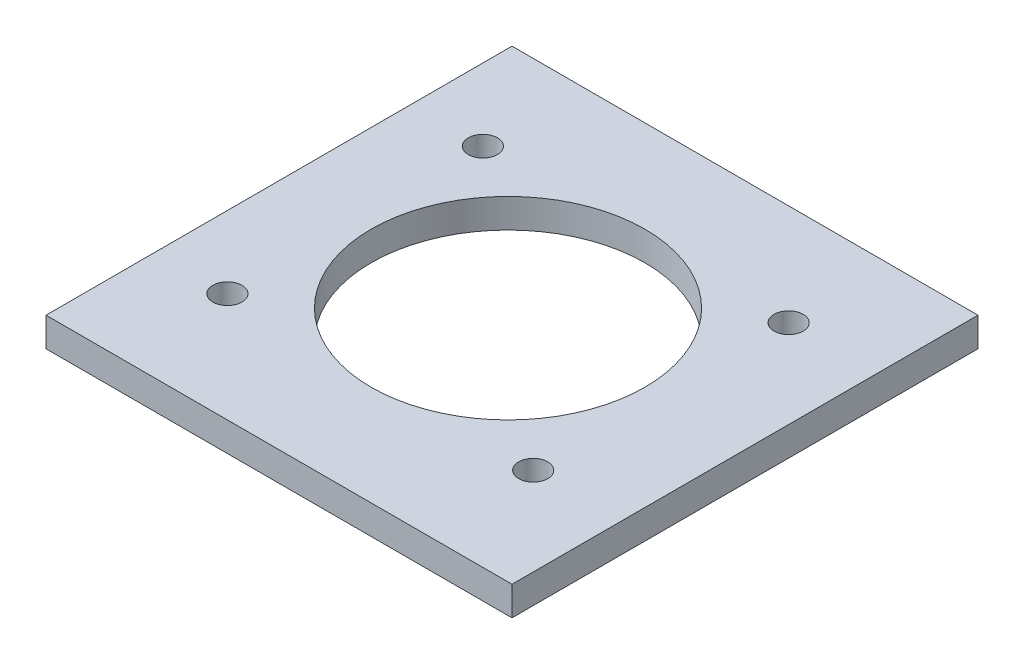
ISO-10303-21;
HEADER;
FILE_DESCRIPTION(('STEP AP214'),'2;1');
FILE_NAME('part.step','',(''),(''),'','','');
FILE_SCHEMA(('AUTOMOTIVE_DESIGN { 1 0 10303 214 1 1 1 1 }'));
ENDSEC;
DATA;
#1=APPLICATION_CONTEXT('core data for automotive mechanical design processes');
#2=APPLICATION_PROTOCOL_DEFINITION('international standard','automotive_design',2000,#1);
#3=PRODUCT_CONTEXT('',#1,'mechanical');
#4=PRODUCT('Part','Part','',(#3));
#5=PRODUCT_RELATED_PRODUCT_CATEGORY('part','',(#4));
#6=PRODUCT_DEFINITION_FORMATION('','',#4);
#7=PRODUCT_DEFINITION_CONTEXT('part definition',#1,'design');
#8=PRODUCT_DEFINITION('design','',#6,#7);
#9=PRODUCT_DEFINITION_SHAPE('','',#8);
#10=(LENGTH_UNIT() NAMED_UNIT(*) SI_UNIT(.MILLI.,.METRE.));
#11=(NAMED_UNIT(*) PLANE_ANGLE_UNIT() SI_UNIT($,.RADIAN.));
#12=(NAMED_UNIT(*) SI_UNIT($,.STERADIAN.) SOLID_ANGLE_UNIT());
#13=UNCERTAINTY_MEASURE_WITH_UNIT(LENGTH_MEASURE(1.E-05),#10,'distance_accuracy_value','');
#14=(GEOMETRIC_REPRESENTATION_CONTEXT(3) GLOBAL_UNCERTAINTY_ASSIGNED_CONTEXT((#13)) GLOBAL_UNIT_ASSIGNED_CONTEXT((#10,
#11,#12)) REPRESENTATION_CONTEXT('',''));
#15=CARTESIAN_POINT('',(0.,0.,0.));
#16=DIRECTION('',(0.,0.,1.));
#17=DIRECTION('',(1.,0.,0.));
#18=AXIS2_PLACEMENT_3D('',#15,#16,#17);
#19=CARTESIAN_POINT('',(0.,4.,0.));
#20=DIRECTION('',(0.,1.,0.));
#21=DIRECTION('',(0.,0.,1.));
#22=AXIS2_PLACEMENT_3D('',#19,#20,#21);
#23=PLANE('',#22);
#24=CARTESIAN_POINT('',(9.89792515025473,4.,-15.0138738301273));
#25=DIRECTION('',(0.,1.,0.));
#26=DIRECTION('',(0.,0.,1.));
#27=AXIS2_PLACEMENT_3D('',#24,#25,#26);
#28=CIRCLE('',#27,2.);
#29=CARTESIAN_POINT('',(9.89792515025473,4.,-13.0138738301273));
#30=VERTEX_POINT('',#29);
#31=EDGE_CURVE('E257',#30,#30,#28,.T.);
#32=ORIENTED_EDGE('',*,*,#31,.F.);
#33=EDGE_LOOP('',(#32));
#34=FACE_BOUND('',#33,.T.);
#35=CARTESIAN_POINT('',(30.8929251502547,4.,-32.5588738301273));
#36=DIRECTION('',(0.,1.,0.));
#37=DIRECTION('',(0.,0.,1.));
#38=AXIS2_PLACEMENT_3D('',#35,#36,#37);
#39=CIRCLE('',#38,18.8);
#40=CARTESIAN_POINT('',(30.8929251502547,4.,-13.7588738301272));
#41=VERTEX_POINT('',#40);
#42=EDGE_CURVE('E273',#41,#41,#39,.T.);
#43=ORIENTED_EDGE('',*,*,#42,.F.);
#44=EDGE_LOOP('',(#43));
#45=FACE_BOUND('',#44,.T.);
#46=DIRECTION('',(1.,0.,0.));
#47=VECTOR('',#46,1.);
#48=CARTESIAN_POINT('',(0.,4.,-64.));
#49=LINE('',#48,#47);
#50=CARTESIAN_POINT('',(0.,4.,-64.));
#51=VERTEX_POINT('',#50);
#52=CARTESIAN_POINT('',(64.,4.,-64.));
#53=VERTEX_POINT('',#52);
#54=EDGE_CURVE('E177',#51,#53,#49,.T.);
#55=ORIENTED_EDGE('',*,*,#54,.F.);
#56=DIRECTION('',(0.,0.,-1.));
#57=VECTOR('',#56,1.);
#58=CARTESIAN_POINT('',(0.,4.,0.));
#59=LINE('',#58,#57);
#60=CARTESIAN_POINT('',(0.,4.,0.));
#61=VERTEX_POINT('',#60);
#62=EDGE_CURVE('E164',#61,#51,#59,.T.);
#63=ORIENTED_EDGE('',*,*,#62,.F.);
#64=DIRECTION('',(1.,0.,0.));
#65=VECTOR('',#64,1.);
#66=CARTESIAN_POINT('',(0.,4.,0.));
#67=LINE('',#66,#65);
#68=CARTESIAN_POINT('',(64.,4.,0.));
#69=VERTEX_POINT('',#68);
#70=EDGE_CURVE('E161',#61,#69,#67,.T.);
#71=ORIENTED_EDGE('',*,*,#70,.T.);
#72=DIRECTION('',(0.,0.,-1.));
#73=VECTOR('',#72,1.);
#74=CARTESIAN_POINT('',(64.,4.,0.));
#75=LINE('',#74,#73);
#76=EDGE_CURVE('E158',#69,#53,#75,.T.);
#77=ORIENTED_EDGE('',*,*,#76,.T.);
#78=EDGE_LOOP('',(#55,#63,#71,#77));
#79=FACE_BOUND('',#78,.T.);
#80=CARTESIAN_POINT('',(51.8929251502547,4.,-50.0988738301273));
#81=DIRECTION('',(0.,1.,0.));
#82=DIRECTION('',(0.,0.,1.));
#83=AXIS2_PLACEMENT_3D('',#80,#81,#82);
#84=CIRCLE('',#83,2.);
#85=CARTESIAN_POINT('',(51.8929251502547,4.,-48.0988738301273));
#86=VERTEX_POINT('',#85);
#87=EDGE_CURVE('E191',#86,#86,#84,.T.);
#88=ORIENTED_EDGE('',*,*,#87,.F.);
#89=EDGE_LOOP('',(#88));
#90=FACE_BOUND('',#89,.T.);
#91=CARTESIAN_POINT('',(9.89792515025473,4.,-50.0988738301273));
#92=DIRECTION('',(0.,1.,0.));
#93=DIRECTION('',(0.,0.,1.));
#94=AXIS2_PLACEMENT_3D('',#91,#92,#93);
#95=CIRCLE('',#94,2.00000000000001);
#96=CARTESIAN_POINT('',(9.89792515025473,4.,-48.0988738301273));
#97=VERTEX_POINT('',#96);
#98=EDGE_CURVE('E265',#97,#97,#95,.T.);
#99=ORIENTED_EDGE('',*,*,#98,.F.);
#100=EDGE_LOOP('',(#99));
#101=FACE_BOUND('',#100,.T.);
#102=CARTESIAN_POINT('',(51.8979251502547,4.,-15.0138738301273));
#103=DIRECTION('',(0.,1.,0.));
#104=DIRECTION('',(0.,0.,1.));
#105=AXIS2_PLACEMENT_3D('',#102,#103,#104);
#106=CIRCLE('',#105,2.);
#107=CARTESIAN_POINT('',(51.8979251502547,4.,-13.0138738301273));
#108=VERTEX_POINT('',#107);
#109=EDGE_CURVE('E246',#108,#108,#106,.T.);
#110=ORIENTED_EDGE('',*,*,#109,.F.);
#111=EDGE_LOOP('',(#110));
#112=FACE_BOUND('',#111,.T.);
#113=ADVANCED_FACE('F114',(#34,#45,#79,#90,#101,#112),#23,.T.);
#114=CARTESIAN_POINT('',(0.,0.,0.));
#115=DIRECTION('',(0.,1.,0.));
#116=DIRECTION('',(0.,0.,1.));
#117=AXIS2_PLACEMENT_3D('',#114,#115,#116);
#118=PLANE('',#117);
#119=DIRECTION('',(1.,0.,0.));
#120=VECTOR('',#119,1.);
#121=CARTESIAN_POINT('',(0.,0.,-64.));
#122=LINE('',#121,#120);
#123=CARTESIAN_POINT('',(0.,0.,-64.));
#124=VERTEX_POINT('',#123);
#125=CARTESIAN_POINT('',(64.,0.,-64.));
#126=VERTEX_POINT('',#125);
#127=EDGE_CURVE('E186',#124,#126,#122,.T.);
#128=ORIENTED_EDGE('',*,*,#127,.T.);
#129=DIRECTION('',(0.,0.,-1.));
#130=VECTOR('',#129,1.);
#131=CARTESIAN_POINT('',(64.,0.,0.));
#132=LINE('',#131,#130);
#133=CARTESIAN_POINT('',(64.,0.,0.));
#134=VERTEX_POINT('',#133);
#135=EDGE_CURVE('E190',#134,#126,#132,.T.);
#136=ORIENTED_EDGE('',*,*,#135,.F.);
#137=DIRECTION('',(1.,0.,0.));
#138=VECTOR('',#137,1.);
#139=CARTESIAN_POINT('',(0.,0.,0.));
#140=LINE('',#139,#138);
#141=CARTESIAN_POINT('',(0.,0.,0.));
#142=VERTEX_POINT('',#141);
#143=EDGE_CURVE('E170',#142,#134,#140,.T.);
#144=ORIENTED_EDGE('',*,*,#143,.F.);
#145=DIRECTION('',(0.,0.,-1.));
#146=VECTOR('',#145,1.);
#147=CARTESIAN_POINT('',(0.,0.,0.));
#148=LINE('',#147,#146);
#149=EDGE_CURVE('E180',#142,#124,#148,.T.);
#150=ORIENTED_EDGE('',*,*,#149,.T.);
#151=EDGE_LOOP('',(#128,#136,#144,#150));
#152=FACE_BOUND('',#151,.T.);
#153=CARTESIAN_POINT('',(51.8929251502547,0.,-50.0988738301273));
#154=DIRECTION('',(0.,1.,0.));
#155=DIRECTION('',(0.,0.,1.));
#156=AXIS2_PLACEMENT_3D('',#153,#154,#155);
#157=CIRCLE('',#156,2.);
#158=CARTESIAN_POINT('',(51.8929251502547,0.,-48.0988738301273));
#159=VERTEX_POINT('',#158);
#160=EDGE_CURVE('E277',#159,#159,#157,.T.);
#161=ORIENTED_EDGE('',*,*,#160,.T.);
#162=EDGE_LOOP('',(#161));
#163=FACE_BOUND('',#162,.T.);
#164=CARTESIAN_POINT('',(30.8929251502547,0.,-32.5588738301273));
#165=DIRECTION('',(0.,1.,0.));
#166=DIRECTION('',(0.,0.,1.));
#167=AXIS2_PLACEMENT_3D('',#164,#165,#166);
#168=CIRCLE('',#167,18.8);
#169=CARTESIAN_POINT('',(30.8929251502547,0.,-13.7588738301272));
#170=VERTEX_POINT('',#169);
#171=EDGE_CURVE('E269',#170,#170,#168,.T.);
#172=ORIENTED_EDGE('',*,*,#171,.T.);
#173=EDGE_LOOP('',(#172));
#174=FACE_BOUND('',#173,.T.);
#175=CARTESIAN_POINT('',(9.89792515025473,0.,-50.0988738301273));
#176=DIRECTION('',(0.,1.,0.));
#177=DIRECTION('',(0.,0.,1.));
#178=AXIS2_PLACEMENT_3D('',#175,#176,#177);
#179=CIRCLE('',#178,2.00000000000001);
#180=CARTESIAN_POINT('',(9.89792515025473,0.,-48.0988738301273));
#181=VERTEX_POINT('',#180);
#182=EDGE_CURVE('E261',#181,#181,#179,.T.);
#183=ORIENTED_EDGE('',*,*,#182,.T.);
#184=EDGE_LOOP('',(#183));
#185=FACE_BOUND('',#184,.T.);
#186=CARTESIAN_POINT('',(9.89792515025473,0.,-15.0138738301273));
#187=DIRECTION('',(0.,1.,0.));
#188=DIRECTION('',(0.,0.,1.));
#189=AXIS2_PLACEMENT_3D('',#186,#187,#188);
#190=CIRCLE('',#189,2.);
#191=CARTESIAN_POINT('',(9.89792515025473,0.,-13.0138738301273));
#192=VERTEX_POINT('',#191);
#193=EDGE_CURVE('E254',#192,#192,#190,.T.);
#194=ORIENTED_EDGE('',*,*,#193,.T.);
#195=EDGE_LOOP('',(#194));
#196=FACE_BOUND('',#195,.T.);
#197=CARTESIAN_POINT('',(51.8979251502547,0.,-15.0138738301273));
#198=DIRECTION('',(0.,1.,0.));
#199=DIRECTION('',(0.,0.,1.));
#200=AXIS2_PLACEMENT_3D('',#197,#198,#199);
#201=CIRCLE('',#200,2.);
#202=CARTESIAN_POINT('',(51.8979251502547,0.,-13.0138738301273));
#203=VERTEX_POINT('',#202);
#204=EDGE_CURVE('E249',#203,#203,#201,.T.);
#205=ORIENTED_EDGE('',*,*,#204,.T.);
#206=EDGE_LOOP('',(#205));
#207=FACE_BOUND('',#206,.T.);
#208=ADVANCED_FACE('F202',(#152,#163,#174,#185,#196,#207),#118,.F.);
#209=CARTESIAN_POINT('',(0.,4.,-64.));
#210=DIRECTION('',(0.,0.,-1.));
#211=DIRECTION('',(-1.,0.,0.));
#212=AXIS2_PLACEMENT_3D('',#209,#210,#211);
#213=PLANE('',#212);
#214=ORIENTED_EDGE('',*,*,#127,.F.);
#215=DIRECTION('',(0.,-1.,0.));
#216=VECTOR('',#215,1.);
#217=CARTESIAN_POINT('',(0.,4.,-64.));
#218=LINE('',#217,#216);
#219=EDGE_CURVE('E12',#51,#124,#218,.T.);
#220=ORIENTED_EDGE('',*,*,#219,.F.);
#221=ORIENTED_EDGE('',*,*,#54,.T.);
#222=DIRECTION('',(0.,-1.,0.));
#223=VECTOR('',#222,1.);
#224=CARTESIAN_POINT('',(64.,4.,-64.));
#225=LINE('',#224,#223);
#226=EDGE_CURVE('E118',#53,#126,#225,.T.);
#227=ORIENTED_EDGE('',*,*,#226,.T.);
#228=EDGE_LOOP('',(#214,#220,#221,#227));
#229=FACE_BOUND('',#228,.T.);
#230=ADVANCED_FACE('F116',(#229),#213,.T.);
#231=CARTESIAN_POINT('',(0.,4.,0.));
#232=DIRECTION('',(-1.,0.,0.));
#233=DIRECTION('',(0.,0.,1.));
#234=AXIS2_PLACEMENT_3D('',#231,#232,#233);
#235=PLANE('',#234);
#236=ORIENTED_EDGE('',*,*,#149,.F.);
#237=DIRECTION('',(0.,-1.,0.));
#238=VECTOR('',#237,1.);
#239=CARTESIAN_POINT('',(0.,4.,0.));
#240=LINE('',#239,#238);
#241=EDGE_CURVE('E125',#61,#142,#240,.T.);
#242=ORIENTED_EDGE('',*,*,#241,.F.);
#243=ORIENTED_EDGE('',*,*,#62,.T.);
#244=ORIENTED_EDGE('',*,*,#219,.T.);
#245=EDGE_LOOP('',(#236,#242,#243,#244));
#246=FACE_BOUND('',#245,.T.);
#247=ADVANCED_FACE('F204',(#246),#235,.T.);
#248=CARTESIAN_POINT('',(0.,4.,0.));
#249=DIRECTION('',(0.,0.,-1.));
#250=DIRECTION('',(-1.,0.,0.));
#251=AXIS2_PLACEMENT_3D('',#248,#249,#250);
#252=PLANE('',#251);
#253=ORIENTED_EDGE('',*,*,#143,.T.);
#254=DIRECTION('',(0.,-1.,0.));
#255=VECTOR('',#254,1.);
#256=CARTESIAN_POINT('',(64.,4.,0.));
#257=LINE('',#256,#255);
#258=EDGE_CURVE('E168',#69,#134,#257,.T.);
#259=ORIENTED_EDGE('',*,*,#258,.F.);
#260=ORIENTED_EDGE('',*,*,#70,.F.);
#261=ORIENTED_EDGE('',*,*,#241,.T.);
#262=EDGE_LOOP('',(#253,#259,#260,#261));
#263=FACE_BOUND('',#262,.T.);
#264=ADVANCED_FACE('F169',(#263),#252,.F.);
#265=CARTESIAN_POINT('',(64.,4.,0.));
#266=DIRECTION('',(-1.,0.,0.));
#267=DIRECTION('',(0.,0.,1.));
#268=AXIS2_PLACEMENT_3D('',#265,#266,#267);
#269=PLANE('',#268);
#270=ORIENTED_EDGE('',*,*,#135,.T.);
#271=ORIENTED_EDGE('',*,*,#226,.F.);
#272=ORIENTED_EDGE('',*,*,#76,.F.);
#273=ORIENTED_EDGE('',*,*,#258,.T.);
#274=EDGE_LOOP('',(#270,#271,#272,#273));
#275=FACE_BOUND('',#274,.T.);
#276=ADVANCED_FACE('F175',(#275),#269,.F.);
#277=CARTESIAN_POINT('',(51.8929251502547,4.,-50.0988738301273));
#278=DIRECTION('',(0.,-1.,0.));
#279=DIRECTION('',(0.,0.,-1.));
#280=AXIS2_PLACEMENT_3D('',#277,#278,#279);
#281=CYLINDRICAL_SURFACE('',#280,2.);
#282=ORIENTED_EDGE('',*,*,#87,.T.);
#283=EDGE_LOOP('',(#282));
#284=FACE_BOUND('',#283,.T.);
#285=ORIENTED_EDGE('',*,*,#160,.F.);
#286=EDGE_LOOP('',(#285));
#287=FACE_BOUND('',#286,.T.);
#288=ADVANCED_FACE('F222',(#284,#287),#281,.F.);
#289=CARTESIAN_POINT('',(30.8929251502547,4.,-32.5588738301273));
#290=DIRECTION('',(0.,-1.,0.));
#291=DIRECTION('',(0.,0.,-1.));
#292=AXIS2_PLACEMENT_3D('',#289,#290,#291);
#293=CYLINDRICAL_SURFACE('',#292,18.8);
#294=ORIENTED_EDGE('',*,*,#42,.T.);
#295=EDGE_LOOP('',(#294));
#296=FACE_BOUND('',#295,.T.);
#297=ORIENTED_EDGE('',*,*,#171,.F.);
#298=EDGE_LOOP('',(#297));
#299=FACE_BOUND('',#298,.T.);
#300=ADVANCED_FACE('F225',(#296,#299),#293,.F.);
#301=CARTESIAN_POINT('',(9.89792515025473,4.,-50.0988738301273));
#302=DIRECTION('',(0.,-1.,0.));
#303=DIRECTION('',(0.,0.,-1.));
#304=AXIS2_PLACEMENT_3D('',#301,#302,#303);
#305=CYLINDRICAL_SURFACE('',#304,2.00000000000001);
#306=ORIENTED_EDGE('',*,*,#98,.T.);
#307=EDGE_LOOP('',(#306));
#308=FACE_BOUND('',#307,.T.);
#309=ORIENTED_EDGE('',*,*,#182,.F.);
#310=EDGE_LOOP('',(#309));
#311=FACE_BOUND('',#310,.T.);
#312=ADVANCED_FACE('F229',(#308,#311),#305,.F.);
#313=CARTESIAN_POINT('',(9.89792515025473,4.,-15.0138738301273));
#314=DIRECTION('',(0.,-1.,0.));
#315=DIRECTION('',(0.,0.,-1.));
#316=AXIS2_PLACEMENT_3D('',#313,#314,#315);
#317=CYLINDRICAL_SURFACE('',#316,2.);
#318=ORIENTED_EDGE('',*,*,#31,.T.);
#319=EDGE_LOOP('',(#318));
#320=FACE_BOUND('',#319,.T.);
#321=ORIENTED_EDGE('',*,*,#193,.F.);
#322=EDGE_LOOP('',(#321));
#323=FACE_BOUND('',#322,.T.);
#324=ADVANCED_FACE('F233',(#320,#323),#317,.F.);
#325=CARTESIAN_POINT('',(51.8979251502547,4.,-15.0138738301273));
#326=DIRECTION('',(0.,-1.,0.));
#327=DIRECTION('',(0.,0.,-1.));
#328=AXIS2_PLACEMENT_3D('',#325,#326,#327);
#329=CYLINDRICAL_SURFACE('',#328,2.);
#330=ORIENTED_EDGE('',*,*,#109,.T.);
#331=EDGE_LOOP('',(#330));
#332=FACE_BOUND('',#331,.T.);
#333=ORIENTED_EDGE('',*,*,#204,.F.);
#334=EDGE_LOOP('',(#333));
#335=FACE_BOUND('',#334,.T.);
#336=ADVANCED_FACE('F237',(#332,#335),#329,.F.);
#337=CLOSED_SHELL('',(#113,#208,#230,#247,#264,#276,#288,#300,#312,#324,#336));
#338=MANIFOLD_SOLID_BREP('B2',#337);
#339=ADVANCED_BREP_SHAPE_REPRESENTATION('',(#18,#338),#14);
#340=SHAPE_DEFINITION_REPRESENTATION(#9,#339);
ENDSEC;
END-ISO-10303-21;
